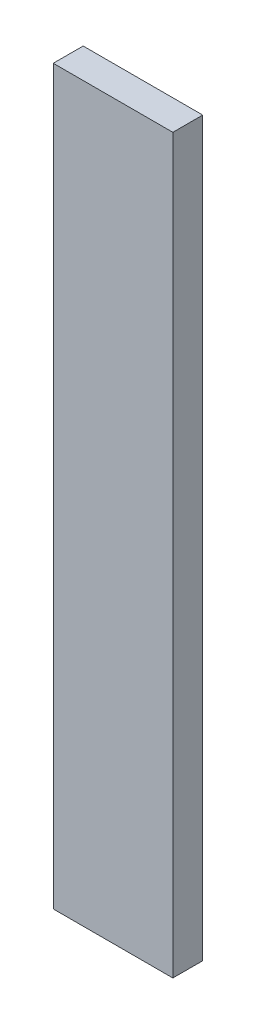
ISO-10303-21;
HEADER;
FILE_DESCRIPTION(('STEP AP214'),'2;1');
FILE_NAME('part.step','',(''),(''),'','','');
FILE_SCHEMA(('AUTOMOTIVE_DESIGN { 1 0 10303 214 1 1 1 1 }'));
ENDSEC;
DATA;
#1=APPLICATION_CONTEXT('core data for automotive mechanical design processes');
#2=APPLICATION_PROTOCOL_DEFINITION('international standard','automotive_design',2000,#1);
#3=PRODUCT_CONTEXT('',#1,'mechanical');
#4=PRODUCT('Part','Part','',(#3));
#5=PRODUCT_RELATED_PRODUCT_CATEGORY('part','',(#4));
#6=PRODUCT_DEFINITION_FORMATION('','',#4);
#7=PRODUCT_DEFINITION_CONTEXT('part definition',#1,'design');
#8=PRODUCT_DEFINITION('design','',#6,#7);
#9=PRODUCT_DEFINITION_SHAPE('','',#8);
#10=(LENGTH_UNIT() NAMED_UNIT(*) SI_UNIT(.MILLI.,.METRE.));
#11=(NAMED_UNIT(*) PLANE_ANGLE_UNIT() SI_UNIT($,.RADIAN.));
#12=(NAMED_UNIT(*) SI_UNIT($,.STERADIAN.) SOLID_ANGLE_UNIT());
#13=UNCERTAINTY_MEASURE_WITH_UNIT(LENGTH_MEASURE(1.E-05),#10,'distance_accuracy_value','');
#14=(GEOMETRIC_REPRESENTATION_CONTEXT(3) GLOBAL_UNCERTAINTY_ASSIGNED_CONTEXT((#13)) GLOBAL_UNIT_ASSIGNED_CONTEXT((#10,
#11,#12)) REPRESENTATION_CONTEXT('',''));
#15=CARTESIAN_POINT('',(0.,0.,0.));
#16=DIRECTION('',(0.,0.,1.));
#17=DIRECTION('',(1.,0.,0.));
#18=AXIS2_PLACEMENT_3D('',#15,#16,#17);
#19=CARTESIAN_POINT('',(25.4,155.575,12.7));
#20=DIRECTION('',(-1.,0.,0.));
#21=DIRECTION('',(0.,0.,1.));
#22=AXIS2_PLACEMENT_3D('',#19,#20,#21);
#23=PLANE('',#22);
#24=DIRECTION('',(0.,1.,0.));
#25=VECTOR('',#24,1.);
#26=CARTESIAN_POINT('',(25.4,155.575,0.));
#27=LINE('',#26,#25);
#28=CARTESIAN_POINT('',(25.4,-155.575,0.));
#29=VERTEX_POINT('',#28);
#30=CARTESIAN_POINT('',(25.4,155.575,0.));
#31=VERTEX_POINT('',#30);
#32=EDGE_CURVE('E96',#29,#31,#27,.T.);
#33=ORIENTED_EDGE('',*,*,#32,.T.);
#34=DIRECTION('',(0.,0.,-1.));
#35=VECTOR('',#34,1.);
#36=CARTESIAN_POINT('',(25.4,155.575,12.7));
#37=LINE('',#36,#35);
#38=CARTESIAN_POINT('',(25.4,155.575,12.7));
#39=VERTEX_POINT('',#38);
#40=EDGE_CURVE('E11',#39,#31,#37,.T.);
#41=ORIENTED_EDGE('',*,*,#40,.F.);
#42=DIRECTION('',(0.,1.,0.));
#43=VECTOR('',#42,1.);
#44=CARTESIAN_POINT('',(25.4,155.575,12.7));
#45=LINE('',#44,#43);
#46=CARTESIAN_POINT('',(25.4,-155.575,12.7));
#47=VERTEX_POINT('',#46);
#48=EDGE_CURVE('E84',#47,#39,#45,.T.);
#49=ORIENTED_EDGE('',*,*,#48,.F.);
#50=DIRECTION('',(0.,0.,-1.));
#51=VECTOR('',#50,1.);
#52=CARTESIAN_POINT('',(25.4,-155.575,12.7));
#53=LINE('',#52,#51);
#54=EDGE_CURVE('E92',#47,#29,#53,.T.);
#55=ORIENTED_EDGE('',*,*,#54,.T.);
#56=EDGE_LOOP('',(#33,#41,#49,#55));
#57=FACE_BOUND('',#56,.T.);
#58=ADVANCED_FACE('F33',(#57),#23,.F.);
#59=CARTESIAN_POINT('',(-25.4,155.575,12.7));
#60=DIRECTION('',(0.,-1.,0.));
#61=DIRECTION('',(0.,0.,-1.));
#62=AXIS2_PLACEMENT_3D('',#59,#60,#61);
#63=PLANE('',#62);
#64=DIRECTION('',(-1.,0.,0.));
#65=VECTOR('',#64,1.);
#66=CARTESIAN_POINT('',(-25.4,155.575,0.));
#67=LINE('',#66,#65);
#68=CARTESIAN_POINT('',(-25.4,155.575,0.));
#69=VERTEX_POINT('',#68);
#70=EDGE_CURVE('E88',#31,#69,#67,.T.);
#71=ORIENTED_EDGE('',*,*,#70,.T.);
#72=DIRECTION('',(0.,0.,-1.));
#73=VECTOR('',#72,1.);
#74=CARTESIAN_POINT('',(-25.4,155.575,12.7));
#75=LINE('',#74,#73);
#76=CARTESIAN_POINT('',(-25.4,155.575,12.7));
#77=VERTEX_POINT('',#76);
#78=EDGE_CURVE('E41',#77,#69,#75,.T.);
#79=ORIENTED_EDGE('',*,*,#78,.F.);
#80=DIRECTION('',(-1.,0.,0.));
#81=VECTOR('',#80,1.);
#82=CARTESIAN_POINT('',(-25.4,155.575,12.7));
#83=LINE('',#82,#81);
#84=EDGE_CURVE('E79',#39,#77,#83,.T.);
#85=ORIENTED_EDGE('',*,*,#84,.F.);
#86=ORIENTED_EDGE('',*,*,#40,.T.);
#87=EDGE_LOOP('',(#71,#79,#85,#86));
#88=FACE_BOUND('',#87,.T.);
#89=ADVANCED_FACE('F87',(#88),#63,.F.);
#90=CARTESIAN_POINT('',(-25.4,155.575,12.7));
#91=DIRECTION('',(1.,0.,0.));
#92=DIRECTION('',(0.,0.,-1.));
#93=AXIS2_PLACEMENT_3D('',#90,#91,#92);
#94=PLANE('',#93);
#95=DIRECTION('',(0.,-1.,0.));
#96=VECTOR('',#95,1.);
#97=CARTESIAN_POINT('',(-25.4,155.575,0.));
#98=LINE('',#97,#96);
#99=CARTESIAN_POINT('',(-25.4,-155.575,0.));
#100=VERTEX_POINT('',#99);
#101=EDGE_CURVE('E66',#69,#100,#98,.T.);
#102=ORIENTED_EDGE('',*,*,#101,.T.);
#103=DIRECTION('',(0.,0.,-1.));
#104=VECTOR('',#103,1.);
#105=CARTESIAN_POINT('',(-25.4,-155.575,12.7));
#106=LINE('',#105,#104);
#107=CARTESIAN_POINT('',(-25.4,-155.575,12.7));
#108=VERTEX_POINT('',#107);
#109=EDGE_CURVE('E89',#108,#100,#106,.T.);
#110=ORIENTED_EDGE('',*,*,#109,.F.);
#111=DIRECTION('',(0.,-1.,0.));
#112=VECTOR('',#111,1.);
#113=CARTESIAN_POINT('',(-25.4,155.575,12.7));
#114=LINE('',#113,#112);
#115=EDGE_CURVE('E82',#77,#108,#114,.T.);
#116=ORIENTED_EDGE('',*,*,#115,.F.);
#117=ORIENTED_EDGE('',*,*,#78,.T.);
#118=EDGE_LOOP('',(#102,#110,#116,#117));
#119=FACE_BOUND('',#118,.T.);
#120=ADVANCED_FACE('F90',(#119),#94,.F.);
#121=CARTESIAN_POINT('',(-25.4,-155.575,12.7));
#122=DIRECTION('',(0.,1.,0.));
#123=DIRECTION('',(0.,0.,1.));
#124=AXIS2_PLACEMENT_3D('',#121,#122,#123);
#125=PLANE('',#124);
#126=DIRECTION('',(1.,0.,0.));
#127=VECTOR('',#126,1.);
#128=CARTESIAN_POINT('',(-25.4,-155.575,0.));
#129=LINE('',#128,#127);
#130=EDGE_CURVE('E72',#100,#29,#129,.T.);
#131=ORIENTED_EDGE('',*,*,#130,.T.);
#132=ORIENTED_EDGE('',*,*,#54,.F.);
#133=DIRECTION('',(1.,0.,0.));
#134=VECTOR('',#133,1.);
#135=CARTESIAN_POINT('',(-25.4,-155.575,12.7));
#136=LINE('',#135,#134);
#137=EDGE_CURVE('E49',#108,#47,#136,.T.);
#138=ORIENTED_EDGE('',*,*,#137,.F.);
#139=ORIENTED_EDGE('',*,*,#109,.T.);
#140=EDGE_LOOP('',(#131,#132,#138,#139));
#141=FACE_BOUND('',#140,.T.);
#142=ADVANCED_FACE('F103',(#141),#125,.F.);
#143=CARTESIAN_POINT('',(0.,0.,12.7));
#144=DIRECTION('',(0.,0.,1.));
#145=DIRECTION('',(1.,0.,0.));
#146=AXIS2_PLACEMENT_3D('',#143,#144,#145);
#147=PLANE('',#146);
#148=ORIENTED_EDGE('',*,*,#48,.T.);
#149=ORIENTED_EDGE('',*,*,#84,.T.);
#150=ORIENTED_EDGE('',*,*,#115,.T.);
#151=ORIENTED_EDGE('',*,*,#137,.T.);
#152=EDGE_LOOP('',(#148,#149,#150,#151));
#153=FACE_BOUND('',#152,.T.);
#154=ADVANCED_FACE('F80',(#153),#147,.T.);
#155=CARTESIAN_POINT('',(0.,0.,0.));
#156=DIRECTION('',(0.,0.,1.));
#157=DIRECTION('',(1.,0.,0.));
#158=AXIS2_PLACEMENT_3D('',#155,#156,#157);
#159=PLANE('',#158);
#160=ORIENTED_EDGE('',*,*,#32,.F.);
#161=ORIENTED_EDGE('',*,*,#130,.F.);
#162=ORIENTED_EDGE('',*,*,#101,.F.);
#163=ORIENTED_EDGE('',*,*,#70,.F.);
#164=EDGE_LOOP('',(#160,#161,#162,#163));
#165=FACE_BOUND('',#164,.T.);
#166=ADVANCED_FACE('F106',(#165),#159,.F.);
#167=CLOSED_SHELL('',(#58,#89,#120,#142,#154,#166));
#168=MANIFOLD_SOLID_BREP('B2',#167);
#169=ADVANCED_BREP_SHAPE_REPRESENTATION('',(#18,#168),#14);
#170=SHAPE_DEFINITION_REPRESENTATION(#9,#169);
ENDSEC;
END-ISO-10303-21;
